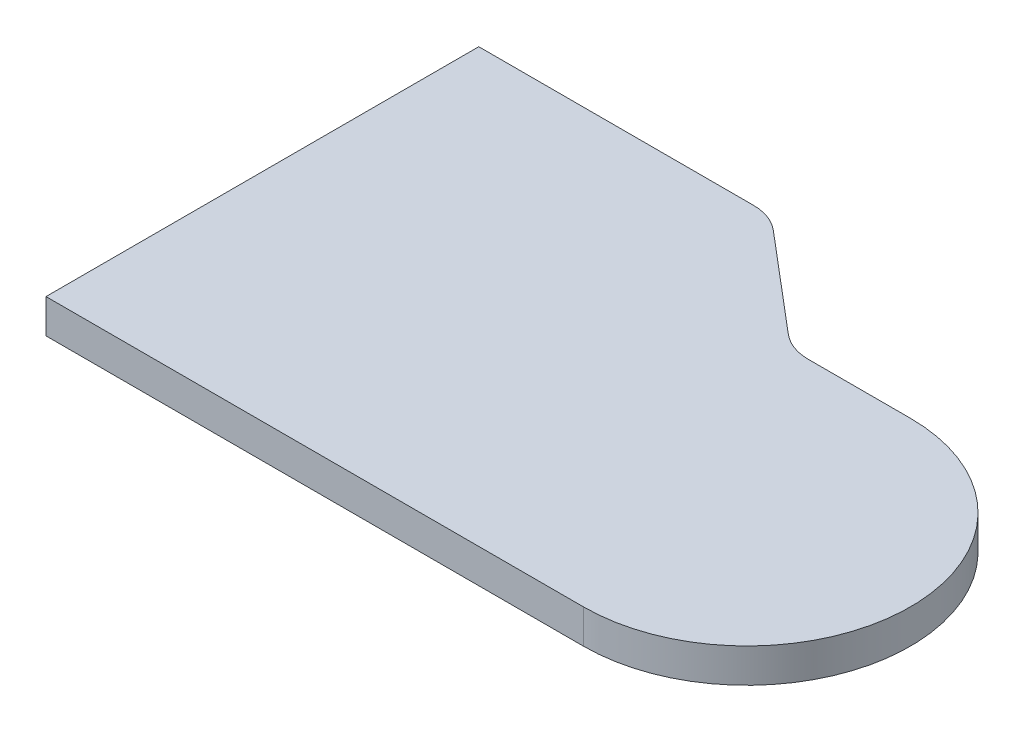
ISO-10303-21;
HEADER;
FILE_DESCRIPTION(('STEP AP214'),'2;1');
FILE_NAME('part.step','',(''),(''),'','','');
FILE_SCHEMA(('AUTOMOTIVE_DESIGN { 1 0 10303 214 1 1 1 1 }'));
ENDSEC;
DATA;
#1=APPLICATION_CONTEXT('core data for automotive mechanical design processes');
#2=APPLICATION_PROTOCOL_DEFINITION('international standard','automotive_design',2000,#1);
#3=PRODUCT_CONTEXT('',#1,'mechanical');
#4=PRODUCT('Part','Part','',(#3));
#5=PRODUCT_RELATED_PRODUCT_CATEGORY('part','',(#4));
#6=PRODUCT_DEFINITION_FORMATION('','',#4);
#7=PRODUCT_DEFINITION_CONTEXT('part definition',#1,'design');
#8=PRODUCT_DEFINITION('design','',#6,#7);
#9=PRODUCT_DEFINITION_SHAPE('','',#8);
#10=(LENGTH_UNIT() NAMED_UNIT(*) SI_UNIT(.MILLI.,.METRE.));
#11=(NAMED_UNIT(*) PLANE_ANGLE_UNIT() SI_UNIT($,.RADIAN.));
#12=(NAMED_UNIT(*) SI_UNIT($,.STERADIAN.) SOLID_ANGLE_UNIT());
#13=UNCERTAINTY_MEASURE_WITH_UNIT(LENGTH_MEASURE(1.E-05),#10,'distance_accuracy_value','');
#14=(GEOMETRIC_REPRESENTATION_CONTEXT(3) GLOBAL_UNCERTAINTY_ASSIGNED_CONTEXT((#13)) GLOBAL_UNIT_ASSIGNED_CONTEXT((#10,
#11,#12)) REPRESENTATION_CONTEXT('',''));
#15=CARTESIAN_POINT('',(0.,0.,0.));
#16=DIRECTION('',(0.,0.,1.));
#17=DIRECTION('',(1.,0.,0.));
#18=AXIS2_PLACEMENT_3D('',#15,#16,#17);
#19=CARTESIAN_POINT('',(0.,-4.445,0.));
#20=DIRECTION('',(-1.,0.,0.));
#21=DIRECTION('',(0.,0.,1.));
#22=AXIS2_PLACEMENT_3D('',#19,#20,#21);
#23=PLANE('',#22);
#24=DIRECTION('',(0.,0.,1.));
#25=VECTOR('',#24,1.);
#26=CARTESIAN_POINT('',(0.,0.,0.));
#27=LINE('',#26,#25);
#28=CARTESIAN_POINT('',(0.,0.,-56.4618457479153));
#29=VERTEX_POINT('',#28);
#30=CARTESIAN_POINT('',(0.,0.,0.));
#31=VERTEX_POINT('',#30);
#32=EDGE_CURVE('E128',#29,#31,#27,.T.);
#33=ORIENTED_EDGE('',*,*,#32,.F.);
#34=DIRECTION('',(0.,1.,0.));
#35=VECTOR('',#34,1.);
#36=CARTESIAN_POINT('',(0.,-4.445,-56.4618457479153));
#37=LINE('',#36,#35);
#38=CARTESIAN_POINT('',(0.,-4.445,-56.4618457479153));
#39=VERTEX_POINT('',#38);
#40=EDGE_CURVE('E11',#39,#29,#37,.T.);
#41=ORIENTED_EDGE('',*,*,#40,.F.);
#42=DIRECTION('',(0.,0.,1.));
#43=VECTOR('',#42,1.);
#44=CARTESIAN_POINT('',(0.,-4.445,0.));
#45=LINE('',#44,#43);
#46=CARTESIAN_POINT('',(0.,-4.445,0.));
#47=VERTEX_POINT('',#46);
#48=EDGE_CURVE('E148',#39,#47,#45,.T.);
#49=ORIENTED_EDGE('',*,*,#48,.T.);
#50=DIRECTION('',(0.,1.,0.));
#51=VECTOR('',#50,1.);
#52=CARTESIAN_POINT('',(0.,-4.445,0.));
#53=LINE('',#52,#51);
#54=EDGE_CURVE('E34',#47,#31,#53,.T.);
#55=ORIENTED_EDGE('',*,*,#54,.T.);
#56=EDGE_LOOP('',(#33,#41,#49,#55));
#57=FACE_BOUND('',#56,.T.);
#58=ADVANCED_FACE('F31',(#57),#23,.T.);
#59=CARTESIAN_POINT('',(35.8202097327324,-4.445,-56.4618457479153));
#60=DIRECTION('',(0.,0.,-1.));
#61=DIRECTION('',(-1.,0.,0.));
#62=AXIS2_PLACEMENT_3D('',#59,#60,#61);
#63=PLANE('',#62);
#64=DIRECTION('',(-1.,0.,0.));
#65=VECTOR('',#64,1.);
#66=CARTESIAN_POINT('',(35.8202097327324,0.,-56.4618457479153));
#67=LINE('',#66,#65);
#68=CARTESIAN_POINT('',(35.8202097327324,0.,-56.4618457479153));
#69=VERTEX_POINT('',#68);
#70=EDGE_CURVE('E146',#69,#29,#67,.T.);
#71=ORIENTED_EDGE('',*,*,#70,.F.);
#72=DIRECTION('',(0.,1.,0.));
#73=VECTOR('',#72,1.);
#74=CARTESIAN_POINT('',(35.8202097327324,-4.445,-56.4618457479153));
#75=LINE('',#74,#73);
#76=CARTESIAN_POINT('',(35.8202097327324,-4.445,-56.4618457479153));
#77=VERTEX_POINT('',#76);
#78=EDGE_CURVE('E40',#77,#69,#75,.T.);
#79=ORIENTED_EDGE('',*,*,#78,.F.);
#80=DIRECTION('',(-1.,0.,0.));
#81=VECTOR('',#80,1.);
#82=CARTESIAN_POINT('',(35.8202097327324,-4.445,-56.4618457479153));
#83=LINE('',#82,#81);
#84=EDGE_CURVE('E118',#77,#39,#83,.T.);
#85=ORIENTED_EDGE('',*,*,#84,.T.);
#86=ORIENTED_EDGE('',*,*,#40,.T.);
#87=EDGE_LOOP('',(#71,#79,#85,#86));
#88=FACE_BOUND('',#87,.T.);
#89=ADVANCED_FACE('F160',(#88),#63,.T.);
#90=CARTESIAN_POINT('',(35.8202097327324,-4.445,-50.1118457479153));
#91=DIRECTION('',(0.,1.,0.));
#92=DIRECTION('',(0.,0.,1.));
#93=AXIS2_PLACEMENT_3D('',#90,#91,#92);
#94=CYLINDRICAL_SURFACE('',#93,6.34999999999999);
#95=CARTESIAN_POINT('',(35.8202097327324,0.,-50.1118457479153));
#96=DIRECTION('',(0.,1.,0.));
#97=DIRECTION('',(0.,0.,1.));
#98=AXIS2_PLACEMENT_3D('',#95,#96,#97);
#99=CIRCLE('',#98,6.34999999999999);
#100=CARTESIAN_POINT('',(39.9219429660426,0.,-54.9593486600091));
#101=VERTEX_POINT('',#100);
#102=EDGE_CURVE('E105',#101,#69,#99,.T.);
#103=ORIENTED_EDGE('',*,*,#102,.F.);
#104=DIRECTION('',(0.,1.,0.));
#105=VECTOR('',#104,1.);
#106=CARTESIAN_POINT('',(39.9219429660426,-4.445,-54.9593486600091));
#107=LINE('',#106,#105);
#108=CARTESIAN_POINT('',(39.9219429660426,-4.445,-54.9593486600091));
#109=VERTEX_POINT('',#108);
#110=EDGE_CURVE('E100',#109,#101,#107,.T.);
#111=ORIENTED_EDGE('',*,*,#110,.F.);
#112=CARTESIAN_POINT('',(35.8202097327324,-4.445,-50.1118457479153));
#113=DIRECTION('',(0.,1.,0.));
#114=DIRECTION('',(0.,0.,1.));
#115=AXIS2_PLACEMENT_3D('',#112,#113,#114);
#116=CIRCLE('',#115,6.34999999999999);
#117=EDGE_CURVE('E103',#109,#77,#116,.T.);
#118=ORIENTED_EDGE('',*,*,#117,.T.);
#119=ORIENTED_EDGE('',*,*,#78,.T.);
#120=EDGE_LOOP('',(#103,#111,#118,#119));
#121=FACE_BOUND('',#120,.T.);
#122=ADVANCED_FACE('F102',(#121),#94,.T.);
#123=CARTESIAN_POINT('',(52.708090795385,-4.445,-44.1403004967194));
#124=DIRECTION('',(0.645942241466173,0.,-0.763386285369115));
#125=DIRECTION('',(-0.763386285369115,0.,-0.645942241466173));
#126=AXIS2_PLACEMENT_3D('',#123,#124,#125);
#127=PLANE('',#126);
#128=DIRECTION('',(-0.763386285369115,0.,-0.645942241466173));
#129=VECTOR('',#128,1.);
#130=CARTESIAN_POINT('',(52.708090795385,0.,-44.1403004967194));
#131=LINE('',#130,#129);
#132=CARTESIAN_POINT('',(52.708090795385,0.,-44.1403004967194));
#133=VERTEX_POINT('',#132);
#134=EDGE_CURVE('E143',#133,#101,#131,.T.);
#135=ORIENTED_EDGE('',*,*,#134,.F.);
#136=DIRECTION('',(0.,1.,0.));
#137=VECTOR('',#136,1.);
#138=CARTESIAN_POINT('',(52.708090795385,-4.445,-44.1403004967194));
#139=LINE('',#138,#137);
#140=CARTESIAN_POINT('',(52.708090795385,-4.445,-44.1403004967194));
#141=VERTEX_POINT('',#140);
#142=EDGE_CURVE('E110',#141,#133,#139,.T.);
#143=ORIENTED_EDGE('',*,*,#142,.F.);
#144=DIRECTION('',(-0.763386285369115,0.,-0.645942241466173));
#145=VECTOR('',#144,1.);
#146=CARTESIAN_POINT('',(52.708090795385,-4.445,-44.1403004967194));
#147=LINE('',#146,#145);
#148=EDGE_CURVE('E116',#141,#109,#147,.T.);
#149=ORIENTED_EDGE('',*,*,#148,.T.);
#150=ORIENTED_EDGE('',*,*,#110,.T.);
#151=EDGE_LOOP('',(#135,#143,#149,#150));
#152=FACE_BOUND('',#151,.T.);
#153=ADVANCED_FACE('F120',(#152),#127,.T.);
#154=CARTESIAN_POINT('',(56.8098240286952,-4.445,-48.9878034088133));
#155=DIRECTION('',(0.,1.,0.));
#156=DIRECTION('',(0.,0.,1.));
#157=AXIS2_PLACEMENT_3D('',#154,#155,#156);
#158=CYLINDRICAL_SURFACE('',#157,6.35);
#159=CARTESIAN_POINT('',(56.8098240286952,0.,-48.9878034088133));
#160=DIRECTION('',(0.,-1.,0.));
#161=DIRECTION('',(0.,0.,1.));
#162=AXIS2_PLACEMENT_3D('',#159,#160,#161);
#163=CIRCLE('',#162,6.35);
#164=CARTESIAN_POINT('',(56.8098240286952,0.,-42.6378034088133));
#165=VERTEX_POINT('',#164);
#166=EDGE_CURVE('E140',#165,#133,#163,.T.);
#167=ORIENTED_EDGE('',*,*,#166,.F.);
#168=DIRECTION('',(0.,1.,0.));
#169=VECTOR('',#168,1.);
#170=CARTESIAN_POINT('',(56.8098240286952,-4.445,-42.6378034088133));
#171=LINE('',#170,#169);
#172=CARTESIAN_POINT('',(56.8098240286952,-4.445,-42.6378034088133));
#173=VERTEX_POINT('',#172);
#174=EDGE_CURVE('E152',#173,#165,#171,.T.);
#175=ORIENTED_EDGE('',*,*,#174,.F.);
#176=CARTESIAN_POINT('',(56.8098240286952,-4.445,-48.9878034088133));
#177=DIRECTION('',(0.,-1.,0.));
#178=DIRECTION('',(0.,0.,1.));
#179=AXIS2_PLACEMENT_3D('',#176,#177,#178);
#180=CIRCLE('',#179,6.35);
#181=EDGE_CURVE('E121',#173,#141,#180,.T.);
#182=ORIENTED_EDGE('',*,*,#181,.T.);
#183=ORIENTED_EDGE('',*,*,#142,.T.);
#184=EDGE_LOOP('',(#167,#175,#182,#183));
#185=FACE_BOUND('',#184,.T.);
#186=ADVANCED_FACE('F173',(#185),#158,.F.);
#187=CARTESIAN_POINT('',(56.8098240286952,-4.445,-42.6378034088133));
#188=DIRECTION('',(0.,0.,-1.));
#189=DIRECTION('',(-1.,0.,0.));
#190=AXIS2_PLACEMENT_3D('',#187,#188,#189);
#191=PLANE('',#190);
#192=DIRECTION('',(-1.,0.,0.));
#193=VECTOR('',#192,1.);
#194=CARTESIAN_POINT('',(56.8098240286952,0.,-42.6378034088133));
#195=LINE('',#194,#193);
#196=CARTESIAN_POINT('',(70.128669853336,0.,-42.6378034088133));
#197=VERTEX_POINT('',#196);
#198=EDGE_CURVE('E137',#197,#165,#195,.T.);
#199=ORIENTED_EDGE('',*,*,#198,.F.);
#200=DIRECTION('',(0.,1.,0.));
#201=VECTOR('',#200,1.);
#202=CARTESIAN_POINT('',(70.128669853336,-4.445,-42.6378034088133));
#203=LINE('',#202,#201);
#204=CARTESIAN_POINT('',(70.128669853336,-4.445,-42.6378034088133));
#205=VERTEX_POINT('',#204);
#206=EDGE_CURVE('E154',#205,#197,#203,.T.);
#207=ORIENTED_EDGE('',*,*,#206,.F.);
#208=DIRECTION('',(-1.,0.,0.));
#209=VECTOR('',#208,1.);
#210=CARTESIAN_POINT('',(56.8098240286952,-4.445,-42.6378034088133));
#211=LINE('',#210,#209);
#212=EDGE_CURVE('E123',#205,#173,#211,.T.);
#213=ORIENTED_EDGE('',*,*,#212,.T.);
#214=ORIENTED_EDGE('',*,*,#174,.T.);
#215=EDGE_LOOP('',(#199,#207,#213,#214));
#216=FACE_BOUND('',#215,.T.);
#217=ADVANCED_FACE('F176',(#216),#191,.T.);
#218=CARTESIAN_POINT('',(70.128669853336,-4.445,-21.3189017044067));
#219=DIRECTION('',(0.,1.,0.));
#220=DIRECTION('',(0.,0.,1.));
#221=AXIS2_PLACEMENT_3D('',#218,#219,#220);
#222=CYLINDRICAL_SURFACE('',#221,21.3189017044067);
#223=CARTESIAN_POINT('',(70.128669853336,0.,-21.3189017044067));
#224=DIRECTION('',(0.,1.,0.));
#225=DIRECTION('',(0.,0.,1.));
#226=AXIS2_PLACEMENT_3D('',#223,#224,#225);
#227=CIRCLE('',#226,21.3189017044067);
#228=CARTESIAN_POINT('',(70.128669853336,0.,0.));
#229=VERTEX_POINT('',#228);
#230=EDGE_CURVE('E134',#229,#197,#227,.T.);
#231=ORIENTED_EDGE('',*,*,#230,.F.);
#232=DIRECTION('',(0.,1.,0.));
#233=VECTOR('',#232,1.);
#234=CARTESIAN_POINT('',(70.128669853336,-4.445,0.));
#235=LINE('',#234,#233);
#236=CARTESIAN_POINT('',(70.128669853336,-4.445,0.));
#237=VERTEX_POINT('',#236);
#238=EDGE_CURVE('E155',#237,#229,#235,.T.);
#239=ORIENTED_EDGE('',*,*,#238,.F.);
#240=CARTESIAN_POINT('',(70.128669853336,-4.445,-21.3189017044067));
#241=DIRECTION('',(0.,1.,0.));
#242=DIRECTION('',(0.,0.,1.));
#243=AXIS2_PLACEMENT_3D('',#240,#241,#242);
#244=CIRCLE('',#243,21.3189017044067);
#245=EDGE_CURVE('E251',#237,#205,#244,.T.);
#246=ORIENTED_EDGE('',*,*,#245,.T.);
#247=ORIENTED_EDGE('',*,*,#206,.T.);
#248=EDGE_LOOP('',(#231,#239,#246,#247));
#249=FACE_BOUND('',#248,.T.);
#250=ADVANCED_FACE('F180',(#249),#222,.T.);
#251=CARTESIAN_POINT('',(0.,-4.445,0.));
#252=DIRECTION('',(0.,0.,1.));
#253=DIRECTION('',(1.,0.,0.));
#254=AXIS2_PLACEMENT_3D('',#251,#252,#253);
#255=PLANE('',#254);
#256=DIRECTION('',(1.,0.,0.));
#257=VECTOR('',#256,1.);
#258=CARTESIAN_POINT('',(0.,0.,0.));
#259=LINE('',#258,#257);
#260=EDGE_CURVE('E131',#31,#229,#259,.T.);
#261=ORIENTED_EDGE('',*,*,#260,.F.);
#262=ORIENTED_EDGE('',*,*,#54,.F.);
#263=DIRECTION('',(1.,0.,0.));
#264=VECTOR('',#263,1.);
#265=CARTESIAN_POINT('',(0.,-4.445,0.));
#266=LINE('',#265,#264);
#267=EDGE_CURVE('E252',#47,#237,#266,.T.);
#268=ORIENTED_EDGE('',*,*,#267,.T.);
#269=ORIENTED_EDGE('',*,*,#238,.T.);
#270=EDGE_LOOP('',(#261,#262,#268,#269));
#271=FACE_BOUND('',#270,.T.);
#272=ADVANCED_FACE('F157',(#271),#255,.T.);
#273=CARTESIAN_POINT('',(35.8202097327324,-4.445,-50.1118457479153));
#274=DIRECTION('',(0.,1.,0.));
#275=DIRECTION('',(0.,0.,1.));
#276=AXIS2_PLACEMENT_3D('',#273,#274,#275);
#277=PLANE('',#276);
#278=ORIENTED_EDGE('',*,*,#48,.F.);
#279=ORIENTED_EDGE('',*,*,#84,.F.);
#280=ORIENTED_EDGE('',*,*,#117,.F.);
#281=ORIENTED_EDGE('',*,*,#148,.F.);
#282=ORIENTED_EDGE('',*,*,#181,.F.);
#283=ORIENTED_EDGE('',*,*,#212,.F.);
#284=ORIENTED_EDGE('',*,*,#245,.F.);
#285=ORIENTED_EDGE('',*,*,#267,.F.);
#286=EDGE_LOOP('',(#278,#279,#280,#281,#282,#283,#284,#285));
#287=FACE_BOUND('',#286,.T.);
#288=ADVANCED_FACE('F114',(#287),#277,.F.);
#289=CARTESIAN_POINT('',(35.8202097327324,0.,-50.1118457479153));
#290=DIRECTION('',(0.,1.,0.));
#291=DIRECTION('',(0.,0.,1.));
#292=AXIS2_PLACEMENT_3D('',#289,#290,#291);
#293=PLANE('',#292);
#294=ORIENTED_EDGE('',*,*,#32,.T.);
#295=ORIENTED_EDGE('',*,*,#260,.T.);
#296=ORIENTED_EDGE('',*,*,#230,.T.);
#297=ORIENTED_EDGE('',*,*,#198,.T.);
#298=ORIENTED_EDGE('',*,*,#166,.T.);
#299=ORIENTED_EDGE('',*,*,#134,.T.);
#300=ORIENTED_EDGE('',*,*,#102,.T.);
#301=ORIENTED_EDGE('',*,*,#70,.T.);
#302=EDGE_LOOP('',(#294,#295,#296,#297,#298,#299,#300,#301));
#303=FACE_BOUND('',#302,.T.);
#304=ADVANCED_FACE('F159',(#303),#293,.T.);
#305=CLOSED_SHELL('',(#58,#89,#122,#153,#186,#217,#250,#272,#288,#304));
#306=MANIFOLD_SOLID_BREP('B2',#305);
#307=ADVANCED_BREP_SHAPE_REPRESENTATION('',(#18,#306),#14);
#308=SHAPE_DEFINITION_REPRESENTATION(#9,#307);
ENDSEC;
END-ISO-10303-21;
